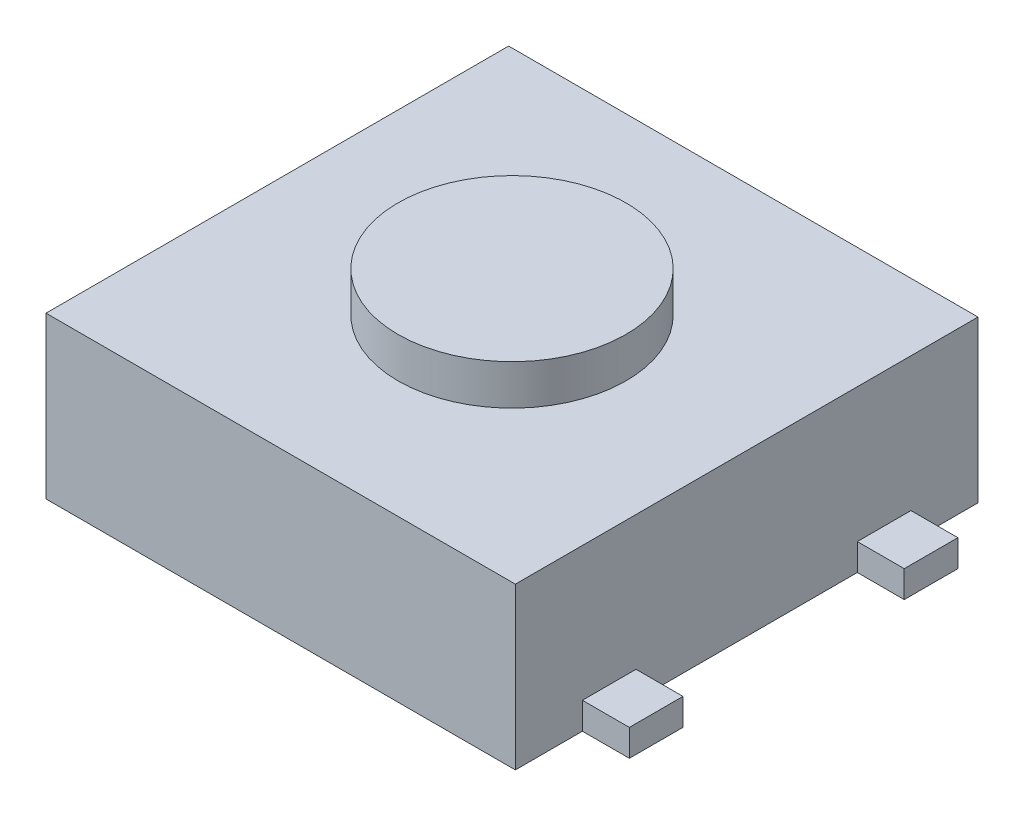
ISO-10303-21;
HEADER;
FILE_DESCRIPTION(('STEP AP214'),'2;1');
FILE_NAME('part.step','',(''),(''),'','','');
FILE_SCHEMA(('AUTOMOTIVE_DESIGN { 1 0 10303 214 1 1 1 1 }'));
ENDSEC;
DATA;
#1=APPLICATION_CONTEXT('core data for automotive mechanical design processes');
#2=APPLICATION_PROTOCOL_DEFINITION('international standard','automotive_design',2000,#1);
#3=PRODUCT_CONTEXT('',#1,'mechanical');
#4=PRODUCT('Part','Part','',(#3));
#5=PRODUCT_RELATED_PRODUCT_CATEGORY('part','',(#4));
#6=PRODUCT_DEFINITION_FORMATION('','',#4);
#7=PRODUCT_DEFINITION_CONTEXT('part definition',#1,'design');
#8=PRODUCT_DEFINITION('design','',#6,#7);
#9=PRODUCT_DEFINITION_SHAPE('','',#8);
#10=(LENGTH_UNIT() NAMED_UNIT(*) SI_UNIT(.MILLI.,.METRE.));
#11=(NAMED_UNIT(*) PLANE_ANGLE_UNIT() SI_UNIT($,.RADIAN.));
#12=(NAMED_UNIT(*) SI_UNIT($,.STERADIAN.) SOLID_ANGLE_UNIT());
#13=UNCERTAINTY_MEASURE_WITH_UNIT(LENGTH_MEASURE(1.E-05),#10,'distance_accuracy_value','');
#14=(GEOMETRIC_REPRESENTATION_CONTEXT(3) GLOBAL_UNCERTAINTY_ASSIGNED_CONTEXT((#13)) GLOBAL_UNIT_ASSIGNED_CONTEXT((#10,
#11,#12)) REPRESENTATION_CONTEXT('',''));
#15=CARTESIAN_POINT('',(0.,0.,0.));
#16=DIRECTION('',(0.,0.,1.));
#17=DIRECTION('',(1.,0.,0.));
#18=AXIS2_PLACEMENT_3D('',#15,#16,#17);
#19=CARTESIAN_POINT('',(1.75,1.5,1.725));
#20=DIRECTION('',(-1.,0.,0.));
#21=DIRECTION('',(0.,0.,1.));
#22=AXIS2_PLACEMENT_3D('',#19,#20,#21);
#23=PLANE('',#22);
#24=DIRECTION('',(0.,-1.,0.));
#25=VECTOR('',#24,1.);
#26=CARTESIAN_POINT('',(1.75,1.5,-1.725));
#27=LINE('',#26,#25);
#28=CARTESIAN_POINT('',(1.75,1.2,-1.725));
#29=VERTEX_POINT('',#28);
#30=CARTESIAN_POINT('',(1.75,0.,-1.725));
#31=VERTEX_POINT('',#30);
#32=EDGE_CURVE('E11',#29,#31,#27,.T.);
#33=ORIENTED_EDGE('',*,*,#32,.F.);
#34=DIRECTION('',(0.,0.,-1.));
#35=VECTOR('',#34,1.);
#36=CARTESIAN_POINT('',(1.75,1.2,1.725));
#37=LINE('',#36,#35);
#38=CARTESIAN_POINT('',(1.75,1.2,1.725));
#39=VERTEX_POINT('',#38);
#40=EDGE_CURVE('E175',#39,#29,#37,.T.);
#41=ORIENTED_EDGE('',*,*,#40,.F.);
#42=DIRECTION('',(0.,-1.,0.));
#43=VECTOR('',#42,1.);
#44=CARTESIAN_POINT('',(1.75,1.5,1.725));
#45=LINE('',#44,#43);
#46=CARTESIAN_POINT('',(1.75,0.,1.725));
#47=VERTEX_POINT('',#46);
#48=EDGE_CURVE('E184',#39,#47,#45,.T.);
#49=ORIENTED_EDGE('',*,*,#48,.T.);
#50=DIRECTION('',(0.,0.,-1.));
#51=VECTOR('',#50,1.);
#52=CARTESIAN_POINT('',(1.75,0.,1.725));
#53=LINE('',#52,#51);
#54=CARTESIAN_POINT('',(1.75,0.,1.225));
#55=VERTEX_POINT('',#54);
#56=EDGE_CURVE('E217',#47,#55,#53,.T.);
#57=ORIENTED_EDGE('',*,*,#56,.T.);
#58=DIRECTION('',(0.,-1.,0.));
#59=VECTOR('',#58,1.);
#60=CARTESIAN_POINT('',(1.75,0.2,1.225));
#61=LINE('',#60,#59);
#62=CARTESIAN_POINT('',(1.75,0.2,1.225));
#63=VERTEX_POINT('',#62);
#64=EDGE_CURVE('E314',#63,#55,#61,.T.);
#65=ORIENTED_EDGE('',*,*,#64,.F.);
#66=DIRECTION('',(0.,0.,-1.));
#67=VECTOR('',#66,1.);
#68=CARTESIAN_POINT('',(1.75,0.2,1.225));
#69=LINE('',#68,#67);
#70=CARTESIAN_POINT('',(1.75,0.2,0.824999999999999));
#71=VERTEX_POINT('',#70);
#72=EDGE_CURVE('E343',#63,#71,#69,.T.);
#73=ORIENTED_EDGE('',*,*,#72,.T.);
#74=DIRECTION('',(0.,-1.,0.));
#75=VECTOR('',#74,1.);
#76=CARTESIAN_POINT('',(1.75,0.2,0.824999999999999));
#77=LINE('',#76,#75);
#78=CARTESIAN_POINT('',(1.75,0.,0.824999999999999));
#79=VERTEX_POINT('',#78);
#80=EDGE_CURVE('E328',#71,#79,#77,.T.);
#81=ORIENTED_EDGE('',*,*,#80,.T.);
#82=CARTESIAN_POINT('',(1.75,0.,-0.824999999999998));
#83=VERTEX_POINT('',#82);
#84=EDGE_CURVE('E240',#79,#83,#53,.T.);
#85=ORIENTED_EDGE('',*,*,#84,.T.);
#86=DIRECTION('',(0.,-1.,0.));
#87=VECTOR('',#86,1.);
#88=CARTESIAN_POINT('',(1.75,0.2,-0.824999999999998));
#89=LINE('',#88,#87);
#90=CARTESIAN_POINT('',(1.75,0.2,-0.824999999999998));
#91=VERTEX_POINT('',#90);
#92=EDGE_CURVE('E62',#91,#83,#89,.T.);
#93=ORIENTED_EDGE('',*,*,#92,.F.);
#94=DIRECTION('',(0.,0.,-1.));
#95=VECTOR('',#94,1.);
#96=CARTESIAN_POINT('',(1.75,0.2,-0.824999999999998));
#97=LINE('',#96,#95);
#98=CARTESIAN_POINT('',(1.75,0.2,-1.225));
#99=VERTEX_POINT('',#98);
#100=EDGE_CURVE('E381',#91,#99,#97,.T.);
#101=ORIENTED_EDGE('',*,*,#100,.T.);
#102=DIRECTION('',(0.,-1.,0.));
#103=VECTOR('',#102,1.);
#104=CARTESIAN_POINT('',(1.75,0.2,-1.225));
#105=LINE('',#104,#103);
#106=CARTESIAN_POINT('',(1.75,0.,-1.225));
#107=VERTEX_POINT('',#106);
#108=EDGE_CURVE('E365',#99,#107,#105,.T.);
#109=ORIENTED_EDGE('',*,*,#108,.T.);
#110=EDGE_CURVE('E242',#107,#31,#53,.T.);
#111=ORIENTED_EDGE('',*,*,#110,.T.);
#112=EDGE_LOOP('',(#33,#41,#49,#57,#65,#73,#81,#85,#93,#101,#109,#111));
#113=FACE_BOUND('',#112,.T.);
#114=ADVANCED_FACE('F39',(#113),#23,.F.);
#115=CARTESIAN_POINT('',(-1.75,1.5,1.725));
#116=DIRECTION('',(1.,0.,0.));
#117=DIRECTION('',(0.,0.,-1.));
#118=AXIS2_PLACEMENT_3D('',#115,#116,#117);
#119=PLANE('',#118);
#120=DIRECTION('',(0.,-1.,0.));
#121=VECTOR('',#120,1.);
#122=CARTESIAN_POINT('',(-1.75,1.5,1.725));
#123=LINE('',#122,#121);
#124=CARTESIAN_POINT('',(-1.75,1.2,1.725));
#125=VERTEX_POINT('',#124);
#126=CARTESIAN_POINT('',(-1.75,0.,1.725));
#127=VERTEX_POINT('',#126);
#128=EDGE_CURVE('E195',#125,#127,#123,.T.);
#129=ORIENTED_EDGE('',*,*,#128,.F.);
#130=DIRECTION('',(0.,0.,1.));
#131=VECTOR('',#130,1.);
#132=CARTESIAN_POINT('',(-1.75,1.2,1.725));
#133=LINE('',#132,#131);
#134=CARTESIAN_POINT('',(-1.75,1.2,-1.725));
#135=VERTEX_POINT('',#134);
#136=EDGE_CURVE('E54',#135,#125,#133,.T.);
#137=ORIENTED_EDGE('',*,*,#136,.F.);
#138=DIRECTION('',(0.,-1.,0.));
#139=VECTOR('',#138,1.);
#140=CARTESIAN_POINT('',(-1.75,1.5,-1.725));
#141=LINE('',#140,#139);
#142=CARTESIAN_POINT('',(-1.75,0.,-1.725));
#143=VERTEX_POINT('',#142);
#144=EDGE_CURVE('E47',#135,#143,#141,.T.);
#145=ORIENTED_EDGE('',*,*,#144,.T.);
#146=DIRECTION('',(0.,0.,1.));
#147=VECTOR('',#146,1.);
#148=CARTESIAN_POINT('',(-1.75,0.,1.725));
#149=LINE('',#148,#147);
#150=CARTESIAN_POINT('',(-1.75,0.,-1.225));
#151=VERTEX_POINT('',#150);
#152=EDGE_CURVE('E200',#143,#151,#149,.T.);
#153=ORIENTED_EDGE('',*,*,#152,.T.);
#154=DIRECTION('',(0.,-1.,0.));
#155=VECTOR('',#154,1.);
#156=CARTESIAN_POINT('',(-1.75,0.2,-1.225));
#157=LINE('',#156,#155);
#158=CARTESIAN_POINT('',(-1.75,0.2,-1.225));
#159=VERTEX_POINT('',#158);
#160=EDGE_CURVE('E280',#159,#151,#157,.T.);
#161=ORIENTED_EDGE('',*,*,#160,.F.);
#162=DIRECTION('',(0.,0.,1.));
#163=VECTOR('',#162,1.);
#164=CARTESIAN_POINT('',(-1.75,0.2,-0.825));
#165=LINE('',#164,#163);
#166=CARTESIAN_POINT('',(-1.75,0.2,-0.825));
#167=VERTEX_POINT('',#166);
#168=EDGE_CURVE('E306',#159,#167,#165,.T.);
#169=ORIENTED_EDGE('',*,*,#168,.T.);
#170=DIRECTION('',(0.,-1.,0.));
#171=VECTOR('',#170,1.);
#172=CARTESIAN_POINT('',(-1.75,0.2,-0.825));
#173=LINE('',#172,#171);
#174=CARTESIAN_POINT('',(-1.75,0.,-0.825));
#175=VERTEX_POINT('',#174);
#176=EDGE_CURVE('E291',#167,#175,#173,.T.);
#177=ORIENTED_EDGE('',*,*,#176,.T.);
#178=CARTESIAN_POINT('',(-1.75,0.,0.824999999999999));
#179=VERTEX_POINT('',#178);
#180=EDGE_CURVE('E225',#175,#179,#149,.T.);
#181=ORIENTED_EDGE('',*,*,#180,.T.);
#182=DIRECTION('',(0.,-1.,0.));
#183=VECTOR('',#182,1.);
#184=CARTESIAN_POINT('',(-1.75,0.2,0.824999999999999));
#185=LINE('',#184,#183);
#186=CARTESIAN_POINT('',(-1.75,0.2,0.824999999999999));
#187=VERTEX_POINT('',#186);
#188=EDGE_CURVE('E246',#187,#179,#185,.T.);
#189=ORIENTED_EDGE('',*,*,#188,.F.);
#190=DIRECTION('',(0.,0.,1.));
#191=VECTOR('',#190,1.);
#192=CARTESIAN_POINT('',(-1.75,0.2,1.225));
#193=LINE('',#192,#191);
#194=CARTESIAN_POINT('',(-1.75,0.2,1.225));
#195=VERTEX_POINT('',#194);
#196=EDGE_CURVE('E285',#187,#195,#193,.T.);
#197=ORIENTED_EDGE('',*,*,#196,.T.);
#198=DIRECTION('',(0.,-1.,0.));
#199=VECTOR('',#198,1.);
#200=CARTESIAN_POINT('',(-1.75,0.2,1.225));
#201=LINE('',#200,#199);
#202=CARTESIAN_POINT('',(-1.75,0.,1.225));
#203=VERTEX_POINT('',#202);
#204=EDGE_CURVE('E232',#195,#203,#201,.T.);
#205=ORIENTED_EDGE('',*,*,#204,.T.);
#206=EDGE_CURVE('E216',#203,#127,#149,.T.);
#207=ORIENTED_EDGE('',*,*,#206,.T.);
#208=EDGE_LOOP('',(#129,#137,#145,#153,#161,#169,#177,#181,#189,#197,#205,#207));
#209=FACE_BOUND('',#208,.T.);
#210=ADVANCED_FACE('F207',(#209),#119,.F.);
#211=CARTESIAN_POINT('',(-1.75,1.5,-1.725));
#212=DIRECTION('',(0.,0.,1.));
#213=DIRECTION('',(1.,0.,0.));
#214=AXIS2_PLACEMENT_3D('',#211,#212,#213);
#215=PLANE('',#214);
#216=ORIENTED_EDGE('',*,*,#144,.F.);
#217=DIRECTION('',(-1.,0.,0.));
#218=VECTOR('',#217,1.);
#219=CARTESIAN_POINT('',(-1.75,1.2,-1.725));
#220=LINE('',#219,#218);
#221=EDGE_CURVE('E188',#29,#135,#220,.T.);
#222=ORIENTED_EDGE('',*,*,#221,.F.);
#223=ORIENTED_EDGE('',*,*,#32,.T.);
#224=DIRECTION('',(-1.,0.,0.));
#225=VECTOR('',#224,1.);
#226=CARTESIAN_POINT('',(-1.75,0.,-1.725));
#227=LINE('',#226,#225);
#228=EDGE_CURVE('E212',#31,#143,#227,.T.);
#229=ORIENTED_EDGE('',*,*,#228,.T.);
#230=EDGE_LOOP('',(#216,#222,#223,#229));
#231=FACE_BOUND('',#230,.T.);
#232=ADVANCED_FACE('F213',(#231),#215,.F.);
#233=CARTESIAN_POINT('',(-1.75,1.5,1.725));
#234=DIRECTION('',(0.,0.,-1.));
#235=DIRECTION('',(-1.,0.,0.));
#236=AXIS2_PLACEMENT_3D('',#233,#234,#235);
#237=PLANE('',#236);
#238=ORIENTED_EDGE('',*,*,#48,.F.);
#239=DIRECTION('',(1.,0.,0.));
#240=VECTOR('',#239,1.);
#241=CARTESIAN_POINT('',(-1.75,1.2,1.725));
#242=LINE('',#241,#240);
#243=EDGE_CURVE('E172',#125,#39,#242,.T.);
#244=ORIENTED_EDGE('',*,*,#243,.F.);
#245=ORIENTED_EDGE('',*,*,#128,.T.);
#246=DIRECTION('',(1.,0.,0.));
#247=VECTOR('',#246,1.);
#248=CARTESIAN_POINT('',(-1.75,0.,1.725));
#249=LINE('',#248,#247);
#250=EDGE_CURVE('E192',#127,#47,#249,.T.);
#251=ORIENTED_EDGE('',*,*,#250,.T.);
#252=EDGE_LOOP('',(#238,#244,#245,#251));
#253=FACE_BOUND('',#252,.T.);
#254=ADVANCED_FACE('F190',(#253),#237,.F.);
#255=CARTESIAN_POINT('',(0.,0.,0.));
#256=DIRECTION('',(0.,-1.,0.));
#257=DIRECTION('',(0.,0.,-1.));
#258=AXIS2_PLACEMENT_3D('',#255,#256,#257);
#259=PLANE('',#258);
#260=ORIENTED_EDGE('',*,*,#56,.F.);
#261=ORIENTED_EDGE('',*,*,#250,.F.);
#262=ORIENTED_EDGE('',*,*,#206,.F.);
#263=DIRECTION('',(-1.,0.,0.));
#264=VECTOR('',#263,1.);
#265=CARTESIAN_POINT('',(-1.75,0.,1.225));
#266=LINE('',#265,#264);
#267=CARTESIAN_POINT('',(-2.1,0.,1.225));
#268=VERTEX_POINT('',#267);
#269=EDGE_CURVE('E277',#203,#268,#266,.T.);
#270=ORIENTED_EDGE('',*,*,#269,.T.);
#271=DIRECTION('',(0.,0.,-1.));
#272=VECTOR('',#271,1.);
#273=CARTESIAN_POINT('',(-2.1,0.,1.225));
#274=LINE('',#273,#272);
#275=CARTESIAN_POINT('',(-2.1,0.,0.825));
#276=VERTEX_POINT('',#275);
#277=EDGE_CURVE('E279',#268,#276,#274,.T.);
#278=ORIENTED_EDGE('',*,*,#277,.T.);
#279=DIRECTION('',(1.,0.,0.));
#280=VECTOR('',#279,1.);
#281=CARTESIAN_POINT('',(-1.75,0.,0.824999999999999));
#282=LINE('',#281,#280);
#283=EDGE_CURVE('E261',#276,#179,#282,.T.);
#284=ORIENTED_EDGE('',*,*,#283,.T.);
#285=ORIENTED_EDGE('',*,*,#180,.F.);
#286=DIRECTION('',(-1.,0.,0.));
#287=VECTOR('',#286,1.);
#288=CARTESIAN_POINT('',(-1.75,0.,-0.825));
#289=LINE('',#288,#287);
#290=CARTESIAN_POINT('',(-2.1,0.,-0.825));
#291=VERTEX_POINT('',#290);
#292=EDGE_CURVE('E310',#175,#291,#289,.T.);
#293=ORIENTED_EDGE('',*,*,#292,.T.);
#294=DIRECTION('',(0.,0.,-1.));
#295=VECTOR('',#294,1.);
#296=CARTESIAN_POINT('',(-2.1,0.,-0.825));
#297=LINE('',#296,#295);
#298=CARTESIAN_POINT('',(-2.1,0.,-1.225));
#299=VERTEX_POINT('',#298);
#300=EDGE_CURVE('E307',#291,#299,#297,.T.);
#301=ORIENTED_EDGE('',*,*,#300,.T.);
#302=DIRECTION('',(1.,0.,0.));
#303=VECTOR('',#302,1.);
#304=CARTESIAN_POINT('',(-1.75,0.,-1.225));
#305=LINE('',#304,#303);
#306=EDGE_CURVE('E223',#299,#151,#305,.T.);
#307=ORIENTED_EDGE('',*,*,#306,.T.);
#308=ORIENTED_EDGE('',*,*,#152,.F.);
#309=ORIENTED_EDGE('',*,*,#228,.F.);
#310=ORIENTED_EDGE('',*,*,#110,.F.);
#311=DIRECTION('',(1.,0.,0.));
#312=VECTOR('',#311,1.);
#313=CARTESIAN_POINT('',(1.75,0.,-1.225));
#314=LINE('',#313,#312);
#315=CARTESIAN_POINT('',(2.1,0.,-1.225));
#316=VERTEX_POINT('',#315);
#317=EDGE_CURVE('E386',#107,#316,#314,.T.);
#318=ORIENTED_EDGE('',*,*,#317,.T.);
#319=DIRECTION('',(0.,0.,1.));
#320=VECTOR('',#319,1.);
#321=CARTESIAN_POINT('',(2.1,0.,-0.825));
#322=LINE('',#321,#320);
#323=CARTESIAN_POINT('',(2.1,0.,-0.825));
#324=VERTEX_POINT('',#323);
#325=EDGE_CURVE('E382',#316,#324,#322,.T.);
#326=ORIENTED_EDGE('',*,*,#325,.T.);
#327=DIRECTION('',(-1.,0.,0.));
#328=VECTOR('',#327,1.);
#329=CARTESIAN_POINT('',(1.75,0.,-0.824999999999998));
#330=LINE('',#329,#328);
#331=EDGE_CURVE('E377',#324,#83,#330,.T.);
#332=ORIENTED_EDGE('',*,*,#331,.T.);
#333=ORIENTED_EDGE('',*,*,#84,.F.);
#334=DIRECTION('',(1.,0.,0.));
#335=VECTOR('',#334,1.);
#336=CARTESIAN_POINT('',(1.75,0.,0.824999999999999));
#337=LINE('',#336,#335);
#338=CARTESIAN_POINT('',(2.1,0.,0.825));
#339=VERTEX_POINT('',#338);
#340=EDGE_CURVE('E347',#79,#339,#337,.T.);
#341=ORIENTED_EDGE('',*,*,#340,.T.);
#342=DIRECTION('',(0.,0.,1.));
#343=VECTOR('',#342,1.);
#344=CARTESIAN_POINT('',(2.1,0.,1.225));
#345=LINE('',#344,#343);
#346=CARTESIAN_POINT('',(2.1,0.,1.225));
#347=VERTEX_POINT('',#346);
#348=EDGE_CURVE('E344',#339,#347,#345,.T.);
#349=ORIENTED_EDGE('',*,*,#348,.T.);
#350=DIRECTION('',(-1.,0.,0.));
#351=VECTOR('',#350,1.);
#352=CARTESIAN_POINT('',(1.75,0.,1.225));
#353=LINE('',#352,#351);
#354=EDGE_CURVE('E237',#347,#55,#353,.T.);
#355=ORIENTED_EDGE('',*,*,#354,.T.);
#356=EDGE_LOOP('',(#260,#261,#262,#270,#278,#284,#285,#293,#301,#307,#308,#309,#310,#318,#326,
#332,#333,#341,#349,#355));
#357=FACE_BOUND('',#356,.T.);
#358=ADVANCED_FACE('F220',(#357),#259,.T.);
#359=CARTESIAN_POINT('',(-1.75,0.2,0.824999999999999));
#360=DIRECTION('',(0.,0.,-1.));
#361=DIRECTION('',(-1.,0.,0.));
#362=AXIS2_PLACEMENT_3D('',#359,#360,#361);
#363=PLANE('',#362);
#364=ORIENTED_EDGE('',*,*,#283,.F.);
#365=DIRECTION('',(0.,-1.,0.));
#366=VECTOR('',#365,1.);
#367=CARTESIAN_POINT('',(-2.1,0.2,0.825));
#368=LINE('',#367,#366);
#369=CARTESIAN_POINT('',(-2.1,0.2,0.825));
#370=VERTEX_POINT('',#369);
#371=EDGE_CURVE('E250',#370,#276,#368,.T.);
#372=ORIENTED_EDGE('',*,*,#371,.F.);
#373=DIRECTION('',(1.,0.,0.));
#374=VECTOR('',#373,1.);
#375=CARTESIAN_POINT('',(-1.75,0.2,0.824999999999999));
#376=LINE('',#375,#374);
#377=EDGE_CURVE('E266',#370,#187,#376,.T.);
#378=ORIENTED_EDGE('',*,*,#377,.T.);
#379=ORIENTED_EDGE('',*,*,#188,.T.);
#380=EDGE_LOOP('',(#364,#372,#378,#379));
#381=FACE_BOUND('',#380,.T.);
#382=ADVANCED_FACE('F444',(#381),#363,.T.);
#383=CARTESIAN_POINT('',(-2.1,0.2,1.225));
#384=DIRECTION('',(-1.,0.,0.));
#385=DIRECTION('',(0.,0.,1.));
#386=AXIS2_PLACEMENT_3D('',#383,#384,#385);
#387=PLANE('',#386);
#388=ORIENTED_EDGE('',*,*,#277,.F.);
#389=DIRECTION('',(0.,-1.,0.));
#390=VECTOR('',#389,1.);
#391=CARTESIAN_POINT('',(-2.1,0.2,1.225));
#392=LINE('',#391,#390);
#393=CARTESIAN_POINT('',(-2.1,0.2,1.225));
#394=VERTEX_POINT('',#393);
#395=EDGE_CURVE('E258',#394,#268,#392,.T.);
#396=ORIENTED_EDGE('',*,*,#395,.F.);
#397=DIRECTION('',(0.,0.,-1.));
#398=VECTOR('',#397,1.);
#399=CARTESIAN_POINT('',(-2.1,0.2,1.225));
#400=LINE('',#399,#398);
#401=EDGE_CURVE('E268',#394,#370,#400,.T.);
#402=ORIENTED_EDGE('',*,*,#401,.T.);
#403=ORIENTED_EDGE('',*,*,#371,.T.);
#404=EDGE_LOOP('',(#388,#396,#402,#403));
#405=FACE_BOUND('',#404,.T.);
#406=ADVANCED_FACE('F452',(#405),#387,.T.);
#407=CARTESIAN_POINT('',(-1.75,0.2,1.225));
#408=DIRECTION('',(0.,0.,1.));
#409=DIRECTION('',(1.,0.,0.));
#410=AXIS2_PLACEMENT_3D('',#407,#408,#409);
#411=PLANE('',#410);
#412=ORIENTED_EDGE('',*,*,#269,.F.);
#413=ORIENTED_EDGE('',*,*,#204,.F.);
#414=DIRECTION('',(-1.,0.,0.));
#415=VECTOR('',#414,1.);
#416=CARTESIAN_POINT('',(-1.75,0.2,1.225));
#417=LINE('',#416,#415);
#418=EDGE_CURVE('E273',#195,#394,#417,.T.);
#419=ORIENTED_EDGE('',*,*,#418,.T.);
#420=ORIENTED_EDGE('',*,*,#395,.T.);
#421=EDGE_LOOP('',(#412,#413,#419,#420));
#422=FACE_BOUND('',#421,.T.);
#423=ADVANCED_FACE('F448',(#422),#411,.T.);
#424=CARTESIAN_POINT('',(0.,0.2,0.));
#425=DIRECTION('',(0.,1.,0.));
#426=DIRECTION('',(0.,0.,1.));
#427=AXIS2_PLACEMENT_3D('',#424,#425,#426);
#428=PLANE('',#427);
#429=ORIENTED_EDGE('',*,*,#196,.F.);
#430=ORIENTED_EDGE('',*,*,#377,.F.);
#431=ORIENTED_EDGE('',*,*,#401,.F.);
#432=ORIENTED_EDGE('',*,*,#418,.F.);
#433=EDGE_LOOP('',(#429,#430,#431,#432));
#434=FACE_BOUND('',#433,.T.);
#435=ADVANCED_FACE('F451',(#434),#428,.T.);
#436=CARTESIAN_POINT('',(-1.75,0.2,-1.225));
#437=DIRECTION('',(0.,0.,-1.));
#438=DIRECTION('',(-1.,0.,0.));
#439=AXIS2_PLACEMENT_3D('',#436,#437,#438);
#440=PLANE('',#439);
#441=ORIENTED_EDGE('',*,*,#306,.F.);
#442=DIRECTION('',(0.,-1.,0.));
#443=VECTOR('',#442,1.);
#444=CARTESIAN_POINT('',(-2.1,0.2,-1.225));
#445=LINE('',#444,#443);
#446=CARTESIAN_POINT('',(-2.1,0.2,-1.225));
#447=VERTEX_POINT('',#446);
#448=EDGE_CURVE('E299',#447,#299,#445,.T.);
#449=ORIENTED_EDGE('',*,*,#448,.F.);
#450=DIRECTION('',(1.,0.,0.));
#451=VECTOR('',#450,1.);
#452=CARTESIAN_POINT('',(-1.75,0.2,-1.225));
#453=LINE('',#452,#451);
#454=EDGE_CURVE('E296',#447,#159,#453,.T.);
#455=ORIENTED_EDGE('',*,*,#454,.T.);
#456=ORIENTED_EDGE('',*,*,#160,.T.);
#457=EDGE_LOOP('',(#441,#449,#455,#456));
#458=FACE_BOUND('',#457,.T.);
#459=ADVANCED_FACE('F461',(#458),#440,.T.);
#460=CARTESIAN_POINT('',(-2.1,0.2,-0.825));
#461=DIRECTION('',(-1.,0.,0.));
#462=DIRECTION('',(0.,0.,1.));
#463=AXIS2_PLACEMENT_3D('',#460,#461,#462);
#464=PLANE('',#463);
#465=ORIENTED_EDGE('',*,*,#300,.F.);
#466=DIRECTION('',(0.,-1.,0.));
#467=VECTOR('',#466,1.);
#468=CARTESIAN_POINT('',(-2.1,0.2,-0.825));
#469=LINE('',#468,#467);
#470=CARTESIAN_POINT('',(-2.1,0.2,-0.825));
#471=VERTEX_POINT('',#470);
#472=EDGE_CURVE('E295',#471,#291,#469,.T.);
#473=ORIENTED_EDGE('',*,*,#472,.F.);
#474=DIRECTION('',(0.,0.,-1.));
#475=VECTOR('',#474,1.);
#476=CARTESIAN_POINT('',(-2.1,0.2,-0.825));
#477=LINE('',#476,#475);
#478=EDGE_CURVE('E318',#471,#447,#477,.T.);
#479=ORIENTED_EDGE('',*,*,#478,.T.);
#480=ORIENTED_EDGE('',*,*,#448,.T.);
#481=EDGE_LOOP('',(#465,#473,#479,#480));
#482=FACE_BOUND('',#481,.T.);
#483=ADVANCED_FACE('F467',(#482),#464,.T.);
#484=CARTESIAN_POINT('',(-1.75,0.2,-0.825));
#485=DIRECTION('',(0.,0.,1.));
#486=DIRECTION('',(1.,0.,0.));
#487=AXIS2_PLACEMENT_3D('',#484,#485,#486);
#488=PLANE('',#487);
#489=ORIENTED_EDGE('',*,*,#292,.F.);
#490=ORIENTED_EDGE('',*,*,#176,.F.);
#491=DIRECTION('',(-1.,0.,0.));
#492=VECTOR('',#491,1.);
#493=CARTESIAN_POINT('',(-1.75,0.2,-0.825));
#494=LINE('',#493,#492);
#495=EDGE_CURVE('E322',#167,#471,#494,.T.);
#496=ORIENTED_EDGE('',*,*,#495,.T.);
#497=ORIENTED_EDGE('',*,*,#472,.T.);
#498=EDGE_LOOP('',(#489,#490,#496,#497));
#499=FACE_BOUND('',#498,.T.);
#500=ADVANCED_FACE('F463',(#499),#488,.T.);
#501=CARTESIAN_POINT('',(0.,0.2,0.));
#502=DIRECTION('',(0.,1.,0.));
#503=DIRECTION('',(0.,0.,1.));
#504=AXIS2_PLACEMENT_3D('',#501,#502,#503);
#505=PLANE('',#504);
#506=ORIENTED_EDGE('',*,*,#168,.F.);
#507=ORIENTED_EDGE('',*,*,#454,.F.);
#508=ORIENTED_EDGE('',*,*,#478,.F.);
#509=ORIENTED_EDGE('',*,*,#495,.F.);
#510=EDGE_LOOP('',(#506,#507,#508,#509));
#511=FACE_BOUND('',#510,.T.);
#512=ADVANCED_FACE('F466',(#511),#505,.T.);
#513=CARTESIAN_POINT('',(1.75,0.2,1.225));
#514=DIRECTION('',(0.,0.,1.));
#515=DIRECTION('',(1.,0.,0.));
#516=AXIS2_PLACEMENT_3D('',#513,#514,#515);
#517=PLANE('',#516);
#518=ORIENTED_EDGE('',*,*,#354,.F.);
#519=DIRECTION('',(0.,-1.,0.));
#520=VECTOR('',#519,1.);
#521=CARTESIAN_POINT('',(2.1,0.2,1.225));
#522=LINE('',#521,#520);
#523=CARTESIAN_POINT('',(2.1,0.2,1.225));
#524=VERTEX_POINT('',#523);
#525=EDGE_CURVE('E336',#524,#347,#522,.T.);
#526=ORIENTED_EDGE('',*,*,#525,.F.);
#527=DIRECTION('',(-1.,0.,0.));
#528=VECTOR('',#527,1.);
#529=CARTESIAN_POINT('',(1.75,0.2,1.225));
#530=LINE('',#529,#528);
#531=EDGE_CURVE('E333',#524,#63,#530,.T.);
#532=ORIENTED_EDGE('',*,*,#531,.T.);
#533=ORIENTED_EDGE('',*,*,#64,.T.);
#534=EDGE_LOOP('',(#518,#526,#532,#533));
#535=FACE_BOUND('',#534,.T.);
#536=ADVANCED_FACE('F477',(#535),#517,.T.);
#537=CARTESIAN_POINT('',(2.1,0.2,1.225));
#538=DIRECTION('',(1.,0.,0.));
#539=DIRECTION('',(0.,0.,-1.));
#540=AXIS2_PLACEMENT_3D('',#537,#538,#539);
#541=PLANE('',#540);
#542=ORIENTED_EDGE('',*,*,#348,.F.);
#543=DIRECTION('',(0.,-1.,0.));
#544=VECTOR('',#543,1.);
#545=CARTESIAN_POINT('',(2.1,0.2,0.825));
#546=LINE('',#545,#544);
#547=CARTESIAN_POINT('',(2.1,0.2,0.825));
#548=VERTEX_POINT('',#547);
#549=EDGE_CURVE('E332',#548,#339,#546,.T.);
#550=ORIENTED_EDGE('',*,*,#549,.F.);
#551=DIRECTION('',(0.,0.,1.));
#552=VECTOR('',#551,1.);
#553=CARTESIAN_POINT('',(2.1,0.2,1.225));
#554=LINE('',#553,#552);
#555=EDGE_CURVE('E354',#548,#524,#554,.T.);
#556=ORIENTED_EDGE('',*,*,#555,.T.);
#557=ORIENTED_EDGE('',*,*,#525,.T.);
#558=EDGE_LOOP('',(#542,#550,#556,#557));
#559=FACE_BOUND('',#558,.T.);
#560=ADVANCED_FACE('F483',(#559),#541,.T.);
#561=CARTESIAN_POINT('',(1.75,0.2,0.824999999999999));
#562=DIRECTION('',(0.,0.,-1.));
#563=DIRECTION('',(-1.,0.,0.));
#564=AXIS2_PLACEMENT_3D('',#561,#562,#563);
#565=PLANE('',#564);
#566=ORIENTED_EDGE('',*,*,#340,.F.);
#567=ORIENTED_EDGE('',*,*,#80,.F.);
#568=DIRECTION('',(1.,0.,0.));
#569=VECTOR('',#568,1.);
#570=CARTESIAN_POINT('',(1.75,0.2,0.824999999999999));
#571=LINE('',#570,#569);
#572=EDGE_CURVE('E358',#71,#548,#571,.T.);
#573=ORIENTED_EDGE('',*,*,#572,.T.);
#574=ORIENTED_EDGE('',*,*,#549,.T.);
#575=EDGE_LOOP('',(#566,#567,#573,#574));
#576=FACE_BOUND('',#575,.T.);
#577=ADVANCED_FACE('F479',(#576),#565,.T.);
#578=CARTESIAN_POINT('',(0.,0.2,0.));
#579=DIRECTION('',(0.,-1.,0.));
#580=DIRECTION('',(0.,0.,-1.));
#581=AXIS2_PLACEMENT_3D('',#578,#579,#580);
#582=PLANE('',#581);
#583=ORIENTED_EDGE('',*,*,#72,.F.);
#584=ORIENTED_EDGE('',*,*,#531,.F.);
#585=ORIENTED_EDGE('',*,*,#555,.F.);
#586=ORIENTED_EDGE('',*,*,#572,.F.);
#587=EDGE_LOOP('',(#583,#584,#585,#586));
#588=FACE_BOUND('',#587,.T.);
#589=ADVANCED_FACE('F482',(#588),#582,.F.);
#590=CARTESIAN_POINT('',(1.75,0.2,-0.824999999999998));
#591=DIRECTION('',(0.,0.,1.));
#592=DIRECTION('',(1.,0.,0.));
#593=AXIS2_PLACEMENT_3D('',#590,#591,#592);
#594=PLANE('',#593);
#595=ORIENTED_EDGE('',*,*,#331,.F.);
#596=DIRECTION('',(0.,-1.,0.));
#597=VECTOR('',#596,1.);
#598=CARTESIAN_POINT('',(2.1,0.2,-0.825));
#599=LINE('',#598,#597);
#600=CARTESIAN_POINT('',(2.1,0.2,-0.825));
#601=VERTEX_POINT('',#600);
#602=EDGE_CURVE('E372',#601,#324,#599,.T.);
#603=ORIENTED_EDGE('',*,*,#602,.F.);
#604=DIRECTION('',(-1.,0.,0.));
#605=VECTOR('',#604,1.);
#606=CARTESIAN_POINT('',(1.75,0.2,-0.824999999999998));
#607=LINE('',#606,#605);
#608=EDGE_CURVE('E369',#601,#91,#607,.T.);
#609=ORIENTED_EDGE('',*,*,#608,.T.);
#610=ORIENTED_EDGE('',*,*,#92,.T.);
#611=EDGE_LOOP('',(#595,#603,#609,#610));
#612=FACE_BOUND('',#611,.T.);
#613=ADVANCED_FACE('F493',(#612),#594,.T.);
#614=CARTESIAN_POINT('',(2.1,0.2,-0.825));
#615=DIRECTION('',(1.,0.,0.));
#616=DIRECTION('',(0.,0.,-1.));
#617=AXIS2_PLACEMENT_3D('',#614,#615,#616);
#618=PLANE('',#617);
#619=ORIENTED_EDGE('',*,*,#325,.F.);
#620=DIRECTION('',(0.,-1.,0.));
#621=VECTOR('',#620,1.);
#622=CARTESIAN_POINT('',(2.1,0.2,-1.225));
#623=LINE('',#622,#621);
#624=CARTESIAN_POINT('',(2.1,0.2,-1.225));
#625=VERTEX_POINT('',#624);
#626=EDGE_CURVE('E368',#625,#316,#623,.T.);
#627=ORIENTED_EDGE('',*,*,#626,.F.);
#628=DIRECTION('',(0.,0.,1.));
#629=VECTOR('',#628,1.);
#630=CARTESIAN_POINT('',(2.1,0.2,-0.825));
#631=LINE('',#630,#629);
#632=EDGE_CURVE('E393',#625,#601,#631,.T.);
#633=ORIENTED_EDGE('',*,*,#632,.T.);
#634=ORIENTED_EDGE('',*,*,#602,.T.);
#635=EDGE_LOOP('',(#619,#627,#633,#634));
#636=FACE_BOUND('',#635,.T.);
#637=ADVANCED_FACE('F497',(#636),#618,.T.);
#638=CARTESIAN_POINT('',(1.75,0.2,-1.225));
#639=DIRECTION('',(0.,0.,-1.));
#640=DIRECTION('',(-1.,0.,0.));
#641=AXIS2_PLACEMENT_3D('',#638,#639,#640);
#642=PLANE('',#641);
#643=ORIENTED_EDGE('',*,*,#317,.F.);
#644=ORIENTED_EDGE('',*,*,#108,.F.);
#645=DIRECTION('',(1.,0.,0.));
#646=VECTOR('',#645,1.);
#647=CARTESIAN_POINT('',(1.75,0.2,-1.225));
#648=LINE('',#647,#646);
#649=EDGE_CURVE('E397',#99,#625,#648,.T.);
#650=ORIENTED_EDGE('',*,*,#649,.T.);
#651=ORIENTED_EDGE('',*,*,#626,.T.);
#652=EDGE_LOOP('',(#643,#644,#650,#651));
#653=FACE_BOUND('',#652,.T.);
#654=ADVANCED_FACE('F428',(#653),#642,.T.);
#655=CARTESIAN_POINT('',(0.,0.2,0.));
#656=DIRECTION('',(0.,-1.,0.));
#657=DIRECTION('',(0.,0.,-1.));
#658=AXIS2_PLACEMENT_3D('',#655,#656,#657);
#659=PLANE('',#658);
#660=ORIENTED_EDGE('',*,*,#100,.F.);
#661=ORIENTED_EDGE('',*,*,#608,.F.);
#662=ORIENTED_EDGE('',*,*,#632,.F.);
#663=ORIENTED_EDGE('',*,*,#649,.F.);
#664=EDGE_LOOP('',(#660,#661,#662,#663));
#665=FACE_BOUND('',#664,.T.);
#666=ADVANCED_FACE('F420',(#665),#659,.F.);
#667=CARTESIAN_POINT('',(0.,1.2,0.));
#668=DIRECTION('',(0.,-1.,0.));
#669=DIRECTION('',(0.,0.,-1.));
#670=AXIS2_PLACEMENT_3D('',#667,#668,#669);
#671=PLANE('',#670);
#672=CARTESIAN_POINT('',(0.,1.2,0.));
#673=DIRECTION('',(0.,1.,0.));
#674=DIRECTION('',(0.,0.,1.));
#675=AXIS2_PLACEMENT_3D('',#672,#673,#674);
#676=CIRCLE('',#675,0.85);
#677=CARTESIAN_POINT('',(0.,1.2,0.85));
#678=VERTEX_POINT('',#677);
#679=EDGE_CURVE('E407',#678,#678,#676,.T.);
#680=ORIENTED_EDGE('',*,*,#679,.F.);
#681=EDGE_LOOP('',(#680));
#682=FACE_BOUND('',#681,.T.);
#683=ORIENTED_EDGE('',*,*,#136,.T.);
#684=ORIENTED_EDGE('',*,*,#243,.T.);
#685=ORIENTED_EDGE('',*,*,#40,.T.);
#686=ORIENTED_EDGE('',*,*,#221,.T.);
#687=EDGE_LOOP('',(#683,#684,#685,#686));
#688=FACE_BOUND('',#687,.T.);
#689=ADVANCED_FACE('F174',(#682,#688),#671,.F.);
#690=CARTESIAN_POINT('',(0.,1.2,0.));
#691=DIRECTION('',(0.,1.,0.));
#692=DIRECTION('',(0.,0.,1.));
#693=AXIS2_PLACEMENT_3D('',#690,#691,#692);
#694=CYLINDRICAL_SURFACE('',#693,0.85);
#695=ORIENTED_EDGE('',*,*,#679,.T.);
#696=EDGE_LOOP('',(#695));
#697=FACE_BOUND('',#696,.T.);
#698=CARTESIAN_POINT('',(0.,1.5,0.));
#699=DIRECTION('',(0.,1.,0.));
#700=DIRECTION('',(0.,0.,1.));
#701=AXIS2_PLACEMENT_3D('',#698,#699,#700);
#702=CIRCLE('',#701,0.85);
#703=CARTESIAN_POINT('',(0.,1.5,0.85));
#704=VERTEX_POINT('',#703);
#705=EDGE_CURVE('E408',#704,#704,#702,.T.);
#706=ORIENTED_EDGE('',*,*,#705,.F.);
#707=EDGE_LOOP('',(#706));
#708=FACE_BOUND('',#707,.T.);
#709=ADVANCED_FACE('F416',(#697,#708),#694,.T.);
#710=CARTESIAN_POINT('',(0.,1.5,0.));
#711=DIRECTION('',(0.,-1.,0.));
#712=DIRECTION('',(0.,0.,-1.));
#713=AXIS2_PLACEMENT_3D('',#710,#711,#712);
#714=PLANE('',#713);
#715=ORIENTED_EDGE('',*,*,#705,.T.);
#716=EDGE_LOOP('',(#715));
#717=FACE_BOUND('',#716,.T.);
#718=ADVANCED_FACE('F426',(#717),#714,.F.);
#719=CLOSED_SHELL('',(#114,#210,#232,#254,#358,#382,#406,#423,#435,#459,#483,#500,#512,#536,
#560,#577,#589,#613,#637,#654,#666,#689,#709,#718));
#720=MANIFOLD_SOLID_BREP('B2',#719);
#721=ADVANCED_BREP_SHAPE_REPRESENTATION('',(#18,#720),#14);
#722=SHAPE_DEFINITION_REPRESENTATION(#9,#721);
ENDSEC;
END-ISO-10303-21;
